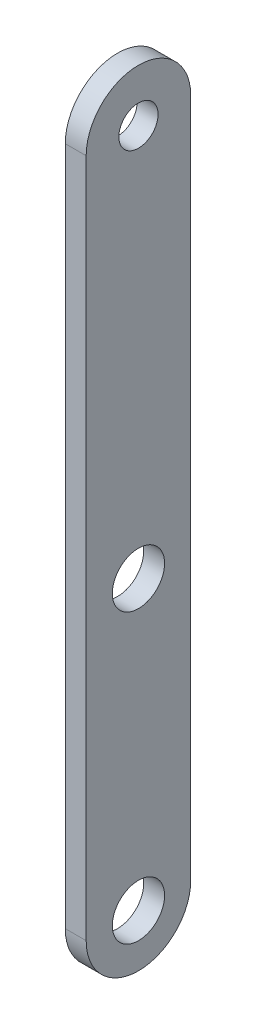
ISO-10303-21;
HEADER;
FILE_DESCRIPTION(('STEP AP214'),'2;1');
FILE_NAME('part.step','',(''),(''),'','','');
FILE_SCHEMA(('AUTOMOTIVE_DESIGN { 1 0 10303 214 1 1 1 1 }'));
ENDSEC;
DATA;
#1=APPLICATION_CONTEXT('core data for automotive mechanical design processes');
#2=APPLICATION_PROTOCOL_DEFINITION('international standard','automotive_design',2000,#1);
#3=PRODUCT_CONTEXT('',#1,'mechanical');
#4=PRODUCT('Part','Part','',(#3));
#5=PRODUCT_RELATED_PRODUCT_CATEGORY('part','',(#4));
#6=PRODUCT_DEFINITION_FORMATION('','',#4);
#7=PRODUCT_DEFINITION_CONTEXT('part definition',#1,'design');
#8=PRODUCT_DEFINITION('design','',#6,#7);
#9=PRODUCT_DEFINITION_SHAPE('','',#8);
#10=(LENGTH_UNIT() NAMED_UNIT(*) SI_UNIT(.MILLI.,.METRE.));
#11=(NAMED_UNIT(*) PLANE_ANGLE_UNIT() SI_UNIT($,.RADIAN.));
#12=(NAMED_UNIT(*) SI_UNIT($,.STERADIAN.) SOLID_ANGLE_UNIT());
#13=UNCERTAINTY_MEASURE_WITH_UNIT(LENGTH_MEASURE(1.E-05),#10,'distance_accuracy_value','');
#14=(GEOMETRIC_REPRESENTATION_CONTEXT(3) GLOBAL_UNCERTAINTY_ASSIGNED_CONTEXT((#13)) GLOBAL_UNIT_ASSIGNED_CONTEXT((#10,
#11,#12)) REPRESENTATION_CONTEXT('',''));
#15=CARTESIAN_POINT('',(0.,0.,0.));
#16=DIRECTION('',(0.,0.,1.));
#17=DIRECTION('',(1.,0.,0.));
#18=AXIS2_PLACEMENT_3D('',#15,#16,#17);
#19=CARTESIAN_POINT('',(-4.,0.,20.));
#20=DIRECTION('',(0.,0.,1.));
#21=DIRECTION('',(0.,-1.,0.));
#22=AXIS2_PLACEMENT_3D('',#19,#20,#21);
#23=PLANE('',#22);
#24=DIRECTION('',(1.,0.,0.));
#25=VECTOR('',#24,1.);
#26=CARTESIAN_POINT('',(-4.,-260.,20.));
#27=LINE('',#26,#25);
#28=CARTESIAN_POINT('',(-4.,-260.,20.));
#29=VERTEX_POINT('',#28);
#30=CARTESIAN_POINT('',(4.,-260.,20.));
#31=VERTEX_POINT('',#30);
#32=EDGE_CURVE('E38',#29,#31,#27,.T.);
#33=ORIENTED_EDGE('',*,*,#32,.T.);
#34=DIRECTION('',(0.,-1.,0.));
#35=VECTOR('',#34,1.);
#36=CARTESIAN_POINT('',(4.,0.,20.));
#37=LINE('',#36,#35);
#38=CARTESIAN_POINT('',(4.,0.,20.));
#39=VERTEX_POINT('',#38);
#40=EDGE_CURVE('E75',#39,#31,#37,.T.);
#41=ORIENTED_EDGE('',*,*,#40,.F.);
#42=DIRECTION('',(1.,0.,0.));
#43=VECTOR('',#42,1.);
#44=CARTESIAN_POINT('',(-4.,0.,20.));
#45=LINE('',#44,#43);
#46=CARTESIAN_POINT('',(-4.,0.,20.));
#47=VERTEX_POINT('',#46);
#48=EDGE_CURVE('E11',#47,#39,#45,.T.);
#49=ORIENTED_EDGE('',*,*,#48,.F.);
#50=DIRECTION('',(0.,-1.,0.));
#51=VECTOR('',#50,1.);
#52=CARTESIAN_POINT('',(-4.,0.,20.));
#53=LINE('',#52,#51);
#54=EDGE_CURVE('E78',#47,#29,#53,.T.);
#55=ORIENTED_EDGE('',*,*,#54,.T.);
#56=EDGE_LOOP('',(#33,#41,#49,#55));
#57=FACE_BOUND('',#56,.T.);
#58=ADVANCED_FACE('F34',(#57),#23,.T.);
#59=CARTESIAN_POINT('',(-4.,0.,0.));
#60=DIRECTION('',(1.,0.,0.));
#61=DIRECTION('',(0.,0.,-1.));
#62=AXIS2_PLACEMENT_3D('',#59,#60,#61);
#63=CYLINDRICAL_SURFACE('',#62,20.);
#64=ORIENTED_EDGE('',*,*,#48,.T.);
#65=CARTESIAN_POINT('',(4.,0.,0.));
#66=DIRECTION('',(1.,0.,0.));
#67=DIRECTION('',(0.,0.,-1.));
#68=AXIS2_PLACEMENT_3D('',#65,#66,#67);
#69=CIRCLE('',#68,20.);
#70=CARTESIAN_POINT('',(4.,0.,-20.));
#71=VERTEX_POINT('',#70);
#72=EDGE_CURVE('E94',#39,#71,#69,.F.);
#73=ORIENTED_EDGE('',*,*,#72,.T.);
#74=DIRECTION('',(1.,0.,0.));
#75=VECTOR('',#74,1.);
#76=CARTESIAN_POINT('',(-4.,0.,-20.));
#77=LINE('',#76,#75);
#78=CARTESIAN_POINT('',(-4.,0.,-20.));
#79=VERTEX_POINT('',#78);
#80=EDGE_CURVE('E43',#79,#71,#77,.T.);
#81=ORIENTED_EDGE('',*,*,#80,.F.);
#82=CARTESIAN_POINT('',(-4.,0.,0.));
#83=DIRECTION('',(1.,0.,0.));
#84=DIRECTION('',(0.,0.,-1.));
#85=AXIS2_PLACEMENT_3D('',#82,#83,#84);
#86=CIRCLE('',#85,20.);
#87=EDGE_CURVE('E83',#47,#79,#86,.F.);
#88=ORIENTED_EDGE('',*,*,#87,.F.);
#89=EDGE_LOOP('',(#64,#73,#81,#88));
#90=FACE_BOUND('',#89,.T.);
#91=ADVANCED_FACE('F121',(#90),#63,.T.);
#92=CARTESIAN_POINT('',(-4.,0.,-20.));
#93=DIRECTION('',(0.,0.,1.));
#94=DIRECTION('',(0.,-1.,0.));
#95=AXIS2_PLACEMENT_3D('',#92,#93,#94);
#96=PLANE('',#95);
#97=ORIENTED_EDGE('',*,*,#80,.T.);
#98=DIRECTION('',(0.,-1.,0.));
#99=VECTOR('',#98,1.);
#100=CARTESIAN_POINT('',(4.,0.,-20.));
#101=LINE('',#100,#99);
#102=CARTESIAN_POINT('',(4.,-260.,-20.));
#103=VERTEX_POINT('',#102);
#104=EDGE_CURVE('E90',#71,#103,#101,.T.);
#105=ORIENTED_EDGE('',*,*,#104,.T.);
#106=DIRECTION('',(1.,0.,0.));
#107=VECTOR('',#106,1.);
#108=CARTESIAN_POINT('',(-4.,-260.,-20.));
#109=LINE('',#108,#107);
#110=CARTESIAN_POINT('',(-4.,-260.,-20.));
#111=VERTEX_POINT('',#110);
#112=EDGE_CURVE('E82',#111,#103,#109,.T.);
#113=ORIENTED_EDGE('',*,*,#112,.F.);
#114=DIRECTION('',(0.,-1.,0.));
#115=VECTOR('',#114,1.);
#116=CARTESIAN_POINT('',(-4.,0.,-20.));
#117=LINE('',#116,#115);
#118=EDGE_CURVE('E57',#79,#111,#117,.T.);
#119=ORIENTED_EDGE('',*,*,#118,.F.);
#120=EDGE_LOOP('',(#97,#105,#113,#119));
#121=FACE_BOUND('',#120,.T.);
#122=ADVANCED_FACE('F119',(#121),#96,.F.);
#123=CARTESIAN_POINT('',(-4.,-150.,0.));
#124=DIRECTION('',(1.,0.,0.));
#125=DIRECTION('',(0.,0.,-1.));
#126=AXIS2_PLACEMENT_3D('',#123,#124,#125);
#127=CYLINDRICAL_SURFACE('',#126,10.);
#128=CARTESIAN_POINT('',(-4.,-150.,0.));
#129=DIRECTION('',(1.,0.,0.));
#130=DIRECTION('',(0.,0.,-1.));
#131=AXIS2_PLACEMENT_3D('',#128,#129,#130);
#132=CIRCLE('',#131,10.);
#133=CARTESIAN_POINT('',(-4.,-150.,-10.));
#134=VERTEX_POINT('',#133);
#135=EDGE_CURVE('E110',#134,#134,#132,.T.);
#136=ORIENTED_EDGE('',*,*,#135,.F.);
#137=EDGE_LOOP('',(#136));
#138=FACE_BOUND('',#137,.T.);
#139=CARTESIAN_POINT('',(4.,-150.,0.));
#140=DIRECTION('',(1.,0.,0.));
#141=DIRECTION('',(0.,0.,-1.));
#142=AXIS2_PLACEMENT_3D('',#139,#140,#141);
#143=CIRCLE('',#142,10.);
#144=CARTESIAN_POINT('',(4.,-150.,-10.));
#145=VERTEX_POINT('',#144);
#146=EDGE_CURVE('E95',#145,#145,#143,.T.);
#147=ORIENTED_EDGE('',*,*,#146,.T.);
#148=EDGE_LOOP('',(#147));
#149=FACE_BOUND('',#148,.T.);
#150=ADVANCED_FACE('F143',(#138,#149),#127,.F.);
#151=CARTESIAN_POINT('',(-4.,0.,0.));
#152=DIRECTION('',(1.,0.,0.));
#153=DIRECTION('',(0.,0.,-1.));
#154=AXIS2_PLACEMENT_3D('',#151,#152,#153);
#155=CYLINDRICAL_SURFACE('',#154,7.5);
#156=CARTESIAN_POINT('',(-4.,0.,0.));
#157=DIRECTION('',(1.,0.,0.));
#158=DIRECTION('',(0.,0.,-1.));
#159=AXIS2_PLACEMENT_3D('',#156,#157,#158);
#160=CIRCLE('',#159,7.5);
#161=CARTESIAN_POINT('',(-4.,0.,-7.5));
#162=VERTEX_POINT('',#161);
#163=EDGE_CURVE('E107',#162,#162,#160,.T.);
#164=ORIENTED_EDGE('',*,*,#163,.F.);
#165=EDGE_LOOP('',(#164));
#166=FACE_BOUND('',#165,.T.);
#167=CARTESIAN_POINT('',(4.,0.,0.));
#168=DIRECTION('',(1.,0.,0.));
#169=DIRECTION('',(0.,0.,-1.));
#170=AXIS2_PLACEMENT_3D('',#167,#168,#169);
#171=CIRCLE('',#170,7.5);
#172=CARTESIAN_POINT('',(4.,0.,-7.5));
#173=VERTEX_POINT('',#172);
#174=EDGE_CURVE('E98',#173,#173,#171,.T.);
#175=ORIENTED_EDGE('',*,*,#174,.T.);
#176=EDGE_LOOP('',(#175));
#177=FACE_BOUND('',#176,.T.);
#178=ADVANCED_FACE('F145',(#166,#177),#155,.F.);
#179=CARTESIAN_POINT('',(-4.,-260.,0.));
#180=DIRECTION('',(1.,0.,0.));
#181=DIRECTION('',(0.,0.,-1.));
#182=AXIS2_PLACEMENT_3D('',#179,#180,#181);
#183=CYLINDRICAL_SURFACE('',#182,10.);
#184=CARTESIAN_POINT('',(-4.,-260.,0.));
#185=DIRECTION('',(1.,0.,0.));
#186=DIRECTION('',(0.,0.,-1.));
#187=AXIS2_PLACEMENT_3D('',#184,#185,#186);
#188=CIRCLE('',#187,10.);
#189=CARTESIAN_POINT('',(-4.,-260.,-10.));
#190=VERTEX_POINT('',#189);
#191=EDGE_CURVE('E104',#190,#190,#188,.T.);
#192=ORIENTED_EDGE('',*,*,#191,.F.);
#193=EDGE_LOOP('',(#192));
#194=FACE_BOUND('',#193,.T.);
#195=CARTESIAN_POINT('',(4.,-260.,0.));
#196=DIRECTION('',(1.,0.,0.));
#197=DIRECTION('',(0.,0.,-1.));
#198=AXIS2_PLACEMENT_3D('',#195,#196,#197);
#199=CIRCLE('',#198,10.);
#200=CARTESIAN_POINT('',(4.,-260.,-10.));
#201=VERTEX_POINT('',#200);
#202=EDGE_CURVE('E158',#201,#201,#199,.T.);
#203=ORIENTED_EDGE('',*,*,#202,.T.);
#204=EDGE_LOOP('',(#203));
#205=FACE_BOUND('',#204,.T.);
#206=ADVANCED_FACE('F36',(#194,#205),#183,.F.);
#207=CARTESIAN_POINT('',(-4.,-260.,0.));
#208=DIRECTION('',(1.,0.,0.));
#209=DIRECTION('',(0.,0.,-1.));
#210=AXIS2_PLACEMENT_3D('',#207,#208,#209);
#211=CYLINDRICAL_SURFACE('',#210,20.);
#212=ORIENTED_EDGE('',*,*,#112,.T.);
#213=CARTESIAN_POINT('',(4.,-260.,0.));
#214=DIRECTION('',(1.,0.,0.));
#215=DIRECTION('',(0.,0.,-1.));
#216=AXIS2_PLACEMENT_3D('',#213,#214,#215);
#217=CIRCLE('',#216,20.);
#218=EDGE_CURVE('E85',#31,#103,#217,.T.);
#219=ORIENTED_EDGE('',*,*,#218,.F.);
#220=ORIENTED_EDGE('',*,*,#32,.F.);
#221=CARTESIAN_POINT('',(-4.,-260.,0.));
#222=DIRECTION('',(1.,0.,0.));
#223=DIRECTION('',(0.,0.,-1.));
#224=AXIS2_PLACEMENT_3D('',#221,#222,#223);
#225=CIRCLE('',#224,20.);
#226=EDGE_CURVE('E114',#29,#111,#225,.T.);
#227=ORIENTED_EDGE('',*,*,#226,.T.);
#228=EDGE_LOOP('',(#212,#219,#220,#227));
#229=FACE_BOUND('',#228,.T.);
#230=ADVANCED_FACE('F86',(#229),#211,.T.);
#231=CARTESIAN_POINT('',(-4.,0.,0.));
#232=DIRECTION('',(1.,0.,0.));
#233=DIRECTION('',(0.,0.,-1.));
#234=AXIS2_PLACEMENT_3D('',#231,#232,#233);
#235=PLANE('',#234);
#236=ORIENTED_EDGE('',*,*,#191,.T.);
#237=EDGE_LOOP('',(#236));
#238=FACE_BOUND('',#237,.T.);
#239=ORIENTED_EDGE('',*,*,#163,.T.);
#240=EDGE_LOOP('',(#239));
#241=FACE_BOUND('',#240,.T.);
#242=ORIENTED_EDGE('',*,*,#135,.T.);
#243=EDGE_LOOP('',(#242));
#244=FACE_BOUND('',#243,.T.);
#245=ORIENTED_EDGE('',*,*,#54,.F.);
#246=ORIENTED_EDGE('',*,*,#87,.T.);
#247=ORIENTED_EDGE('',*,*,#118,.T.);
#248=ORIENTED_EDGE('',*,*,#226,.F.);
#249=EDGE_LOOP('',(#245,#246,#247,#248));
#250=FACE_BOUND('',#249,.T.);
#251=ADVANCED_FACE('F123',(#238,#241,#244,#250),#235,.F.);
#252=CARTESIAN_POINT('',(4.,0.,0.));
#253=DIRECTION('',(1.,0.,0.));
#254=DIRECTION('',(0.,0.,-1.));
#255=AXIS2_PLACEMENT_3D('',#252,#253,#254);
#256=PLANE('',#255);
#257=ORIENTED_EDGE('',*,*,#202,.F.);
#258=EDGE_LOOP('',(#257));
#259=FACE_BOUND('',#258,.T.);
#260=ORIENTED_EDGE('',*,*,#174,.F.);
#261=EDGE_LOOP('',(#260));
#262=FACE_BOUND('',#261,.T.);
#263=ORIENTED_EDGE('',*,*,#146,.F.);
#264=EDGE_LOOP('',(#263));
#265=FACE_BOUND('',#264,.T.);
#266=ORIENTED_EDGE('',*,*,#40,.T.);
#267=ORIENTED_EDGE('',*,*,#218,.T.);
#268=ORIENTED_EDGE('',*,*,#104,.F.);
#269=ORIENTED_EDGE('',*,*,#72,.F.);
#270=EDGE_LOOP('',(#266,#267,#268,#269));
#271=FACE_BOUND('',#270,.T.);
#272=ADVANCED_FACE('F92',(#259,#262,#265,#271),#256,.T.);
#273=CLOSED_SHELL('',(#58,#91,#122,#150,#178,#206,#230,#251,#272));
#274=MANIFOLD_SOLID_BREP('B2',#273);
#275=ADVANCED_BREP_SHAPE_REPRESENTATION('',(#18,#274),#14);
#276=SHAPE_DEFINITION_REPRESENTATION(#9,#275);
ENDSEC;
END-ISO-10303-21;
